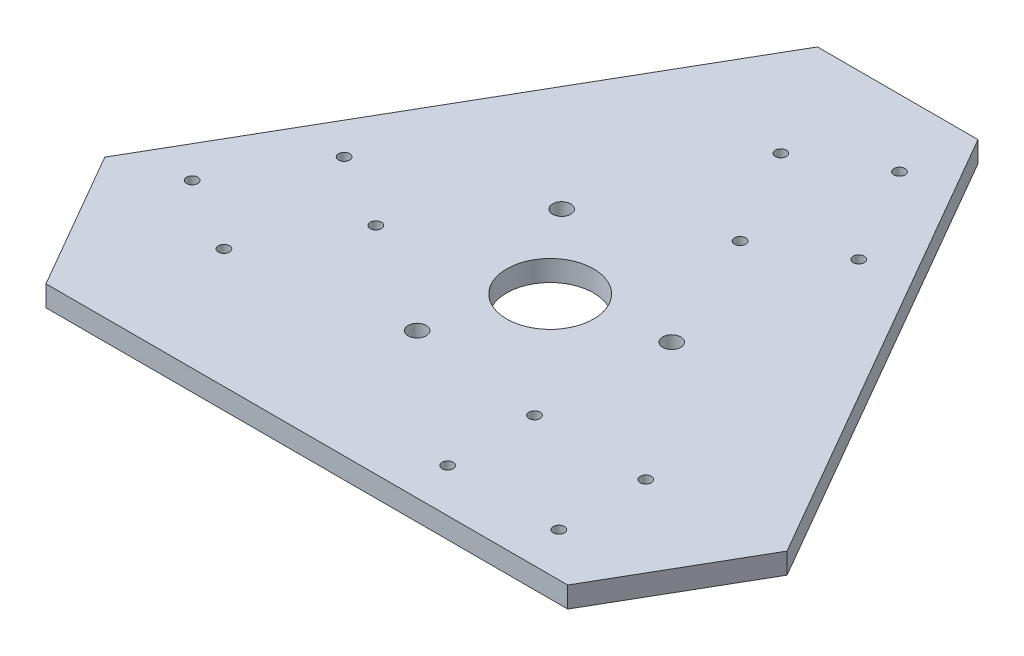
ISO-10303-21;
HEADER;
FILE_DESCRIPTION(('STEP AP214'),'2;1');
FILE_NAME('part.step','',(''),(''),'','','');
FILE_SCHEMA(('AUTOMOTIVE_DESIGN { 1 0 10303 214 1 1 1 1 }'));
ENDSEC;
DATA;
#1=APPLICATION_CONTEXT('core data for automotive mechanical design processes');
#2=APPLICATION_PROTOCOL_DEFINITION('international standard','automotive_design',2000,#1);
#3=PRODUCT_CONTEXT('',#1,'mechanical');
#4=PRODUCT('Part','Part','',(#3));
#5=PRODUCT_RELATED_PRODUCT_CATEGORY('part','',(#4));
#6=PRODUCT_DEFINITION_FORMATION('','',#4);
#7=PRODUCT_DEFINITION_CONTEXT('part definition',#1,'design');
#8=PRODUCT_DEFINITION('design','',#6,#7);
#9=PRODUCT_DEFINITION_SHAPE('','',#8);
#10=(LENGTH_UNIT() NAMED_UNIT(*) SI_UNIT(.MILLI.,.METRE.));
#11=(NAMED_UNIT(*) PLANE_ANGLE_UNIT() SI_UNIT($,.RADIAN.));
#12=(NAMED_UNIT(*) SI_UNIT($,.STERADIAN.) SOLID_ANGLE_UNIT());
#13=UNCERTAINTY_MEASURE_WITH_UNIT(LENGTH_MEASURE(1.E-05),#10,'distance_accuracy_value','');
#14=(GEOMETRIC_REPRESENTATION_CONTEXT(3) GLOBAL_UNCERTAINTY_ASSIGNED_CONTEXT((#13)) GLOBAL_UNIT_ASSIGNED_CONTEXT((#10,
#11,#12)) REPRESENTATION_CONTEXT('',''));
#15=CARTESIAN_POINT('',(0.,0.,0.));
#16=DIRECTION('',(0.,0.,1.));
#17=DIRECTION('',(1.,0.,0.));
#18=AXIS2_PLACEMENT_3D('',#15,#16,#17);
#19=CARTESIAN_POINT('',(57.7350269189626,6.,100.));
#20=DIRECTION('',(-0.866025403784439,0.,-0.5));
#21=DIRECTION('',(-0.5,0.,0.866025403784439));
#22=AXIS2_PLACEMENT_3D('',#19,#20,#21);
#23=PLANE('',#22);
#24=DIRECTION('',(0.5,0.,-0.866025403784439));
#25=VECTOR('',#24,1.);
#26=CARTESIAN_POINT('',(57.7350269189626,0.,100.));
#27=LINE('',#26,#25);
#28=CARTESIAN_POINT('',(75.0555349946514,0.,70.));
#29=VERTEX_POINT('',#28);
#30=CARTESIAN_POINT('',(98.1495457622364,0.,30.0000000000001));
#31=VERTEX_POINT('',#30);
#32=EDGE_CURVE('E102',#29,#31,#27,.T.);
#33=ORIENTED_EDGE('',*,*,#32,.T.);
#34=DIRECTION('',(0.,1.,0.));
#35=VECTOR('',#34,1.);
#36=CARTESIAN_POINT('',(98.1495457622363,0.,30.));
#37=LINE('',#36,#35);
#38=CARTESIAN_POINT('',(98.1495457622363,6.,30.));
#39=VERTEX_POINT('',#38);
#40=EDGE_CURVE('E132',#31,#39,#37,.T.);
#41=ORIENTED_EDGE('',*,*,#40,.T.);
#42=DIRECTION('',(0.5,0.,-0.866025403784439));
#43=VECTOR('',#42,1.);
#44=CARTESIAN_POINT('',(57.7350269189626,6.,100.));
#45=LINE('',#44,#43);
#46=CARTESIAN_POINT('',(75.0555349946514,6.,70.));
#47=VERTEX_POINT('',#46);
#48=EDGE_CURVE('E104',#47,#39,#45,.T.);
#49=ORIENTED_EDGE('',*,*,#48,.F.);
#50=DIRECTION('',(0.,1.,0.));
#51=VECTOR('',#50,1.);
#52=CARTESIAN_POINT('',(75.0555349946514,0.,70.));
#53=LINE('',#52,#51);
#54=EDGE_CURVE('E90',#29,#47,#53,.T.);
#55=ORIENTED_EDGE('',*,*,#54,.F.);
#56=EDGE_LOOP('',(#33,#41,#49,#55));
#57=FACE_BOUND('',#56,.T.);
#58=ADVANCED_FACE('F36',(#57),#23,.F.);
#59=CARTESIAN_POINT('',(57.7350269189626,6.,-100.));
#60=DIRECTION('',(0.,0.,1.));
#61=DIRECTION('',(1.,0.,0.));
#62=AXIS2_PLACEMENT_3D('',#59,#60,#61);
#63=PLANE('',#62);
#64=DIRECTION('',(-1.,0.,0.));
#65=VECTOR('',#64,1.);
#66=CARTESIAN_POINT('',(57.7350269189626,6.,-100.));
#67=LINE('',#66,#65);
#68=CARTESIAN_POINT('',(23.0940107675849,6.,-100.));
#69=VERTEX_POINT('',#68);
#70=CARTESIAN_POINT('',(-23.0940107675851,6.,-100.));
#71=VERTEX_POINT('',#70);
#72=EDGE_CURVE('E44',#69,#71,#67,.T.);
#73=ORIENTED_EDGE('',*,*,#72,.F.);
#74=DIRECTION('',(0.,1.,0.));
#75=VECTOR('',#74,1.);
#76=CARTESIAN_POINT('',(23.0940107675849,0.,-100.));
#77=LINE('',#76,#75);
#78=CARTESIAN_POINT('',(23.0940107675849,0.,-100.));
#79=VERTEX_POINT('',#78);
#80=EDGE_CURVE('E130',#79,#69,#77,.T.);
#81=ORIENTED_EDGE('',*,*,#80,.F.);
#82=DIRECTION('',(-1.,0.,0.));
#83=VECTOR('',#82,1.);
#84=CARTESIAN_POINT('',(57.7350269189626,0.,-100.));
#85=LINE('',#84,#83);
#86=CARTESIAN_POINT('',(-23.094010767585,0.,-100.));
#87=VERTEX_POINT('',#86);
#88=EDGE_CURVE('E110',#79,#87,#85,.T.);
#89=ORIENTED_EDGE('',*,*,#88,.T.);
#90=DIRECTION('',(0.,1.,0.));
#91=VECTOR('',#90,1.);
#92=CARTESIAN_POINT('',(-23.0940107675851,0.,-100.));
#93=LINE('',#92,#91);
#94=EDGE_CURVE('E52',#87,#71,#93,.T.);
#95=ORIENTED_EDGE('',*,*,#94,.T.);
#96=EDGE_LOOP('',(#73,#81,#89,#95));
#97=FACE_BOUND('',#96,.T.);
#98=ADVANCED_FACE('F271',(#97),#63,.F.);
#99=CARTESIAN_POINT('',(-115.470053837925,6.,0.));
#100=DIRECTION('',(0.866025403784439,0.,-0.5));
#101=DIRECTION('',(-0.5,0.,-0.866025403784439));
#102=AXIS2_PLACEMENT_3D('',#99,#100,#101);
#103=PLANE('',#102);
#104=DIRECTION('',(0.5,0.,0.866025403784439));
#105=VECTOR('',#104,1.);
#106=CARTESIAN_POINT('',(-115.470053837925,0.,0.));
#107=LINE('',#106,#105);
#108=CARTESIAN_POINT('',(-98.1495457622364,0.,30.));
#109=VERTEX_POINT('',#108);
#110=CARTESIAN_POINT('',(-75.0555349946514,0.,70.));
#111=VERTEX_POINT('',#110);
#112=EDGE_CURVE('E39',#109,#111,#107,.T.);
#113=ORIENTED_EDGE('',*,*,#112,.T.);
#114=DIRECTION('',(0.,1.,0.));
#115=VECTOR('',#114,1.);
#116=CARTESIAN_POINT('',(-75.0555349946514,0.,70.));
#117=LINE('',#116,#115);
#118=CARTESIAN_POINT('',(-75.0555349946514,6.,70.));
#119=VERTEX_POINT('',#118);
#120=EDGE_CURVE('E60',#111,#119,#117,.T.);
#121=ORIENTED_EDGE('',*,*,#120,.T.);
#122=DIRECTION('',(0.5,0.,0.866025403784439));
#123=VECTOR('',#122,1.);
#124=CARTESIAN_POINT('',(-115.470053837925,6.,0.));
#125=LINE('',#124,#123);
#126=CARTESIAN_POINT('',(-98.1495457622364,6.,30.));
#127=VERTEX_POINT('',#126);
#128=EDGE_CURVE('E11',#127,#119,#125,.T.);
#129=ORIENTED_EDGE('',*,*,#128,.F.);
#130=DIRECTION('',(0.,1.,0.));
#131=VECTOR('',#130,1.);
#132=CARTESIAN_POINT('',(-98.1495457622364,0.,30.));
#133=LINE('',#132,#131);
#134=EDGE_CURVE('E123',#109,#127,#133,.T.);
#135=ORIENTED_EDGE('',*,*,#134,.F.);
#136=EDGE_LOOP('',(#113,#121,#129,#135));
#137=FACE_BOUND('',#136,.T.);
#138=ADVANCED_FACE('F236',(#137),#103,.F.);
#139=CARTESIAN_POINT('',(0.,6.,0.));
#140=DIRECTION('',(0.,1.,0.));
#141=DIRECTION('',(0.,0.,1.));
#142=AXIS2_PLACEMENT_3D('',#139,#140,#141);
#143=PLANE('',#142);
#144=CARTESIAN_POINT('',(-58.1458256229943,6.,35.7115242270663));
#145=DIRECTION('',(0.,1.,0.));
#146=DIRECTION('',(0.,0.,1.));
#147=AXIS2_PLACEMENT_3D('',#144,#145,#146);
#148=CIRCLE('',#147,1.59999999999999);
#149=CARTESIAN_POINT('',(-58.1458256229943,6.,37.3115242270663));
#150=VERTEX_POINT('',#149);
#151=EDGE_CURVE('E204',#150,#150,#148,.T.);
#152=ORIENTED_EDGE('',*,*,#151,.F.);
#153=EDGE_LOOP('',(#152));
#154=FACE_BOUND('',#153,.T.);
#155=CARTESIAN_POINT('',(28.,6.,57.5));
#156=DIRECTION('',(0.,1.,0.));
#157=DIRECTION('',(0.,0.,1.));
#158=AXIS2_PLACEMENT_3D('',#155,#156,#157);
#159=CIRCLE('',#158,1.6);
#160=CARTESIAN_POINT('',(28.,6.,59.1));
#161=VERTEX_POINT('',#160);
#162=EDGE_CURVE('E194',#161,#161,#159,.T.);
#163=ORIENTED_EDGE('',*,*,#162,.F.);
#164=EDGE_LOOP('',(#163));
#165=FACE_BOUND('',#164,.T.);
#166=CARTESIAN_POINT('',(60.,6.,57.5));
#167=DIRECTION('',(0.,1.,0.));
#168=DIRECTION('',(0.,0.,1.));
#169=AXIS2_PLACEMENT_3D('',#166,#167,#168);
#170=CIRCLE('',#169,1.60000000000001);
#171=CARTESIAN_POINT('',(60.,6.,59.1));
#172=VERTEX_POINT('',#171);
#173=EDGE_CURVE('E193',#172,#172,#170,.T.);
#174=ORIENTED_EDGE('',*,*,#173,.F.);
#175=EDGE_LOOP('',(#174));
#176=FACE_BOUND('',#175,.T.);
#177=CARTESIAN_POINT('',(28.,6.,32.5));
#178=DIRECTION('',(0.,1.,0.));
#179=DIRECTION('',(0.,0.,1.));
#180=AXIS2_PLACEMENT_3D('',#177,#178,#179);
#181=CIRCLE('',#180,1.6);
#182=CARTESIAN_POINT('',(28.,6.,34.1));
#183=VERTEX_POINT('',#182);
#184=EDGE_CURVE('E161',#183,#183,#181,.T.);
#185=ORIENTED_EDGE('',*,*,#184,.F.);
#186=EDGE_LOOP('',(#185));
#187=FACE_BOUND('',#186,.T.);
#188=CARTESIAN_POINT('',(-42.1458256229943,6.,7.9987113059643));
#189=DIRECTION('',(0.,1.,0.));
#190=DIRECTION('',(0.,0.,1.));
#191=AXIS2_PLACEMENT_3D('',#188,#189,#190);
#192=CIRCLE('',#191,1.6);
#193=CARTESIAN_POINT('',(-42.1458256229943,6.,9.5987113059643));
#194=VERTEX_POINT('',#193);
#195=EDGE_CURVE('E186',#194,#194,#192,.T.);
#196=ORIENTED_EDGE('',*,*,#195,.F.);
#197=EDGE_LOOP('',(#196));
#198=FACE_BOUND('',#197,.T.);
#199=CARTESIAN_POINT('',(-79.7964607176052,6.,23.2115242270663));
#200=DIRECTION('',(0.,1.,0.));
#201=DIRECTION('',(0.,0.,1.));
#202=AXIS2_PLACEMENT_3D('',#199,#200,#201);
#203=CIRCLE('',#202,1.59999999999999);
#204=CARTESIAN_POINT('',(-79.7964607176052,6.,24.8115242270663));
#205=VERTEX_POINT('',#204);
#206=EDGE_CURVE('E180',#205,#205,#203,.T.);
#207=ORIENTED_EDGE('',*,*,#206,.F.);
#208=EDGE_LOOP('',(#207));
#209=FACE_BOUND('',#208,.T.);
#210=CARTESIAN_POINT('',(-63.7964607176052,6.,-4.5012886940357));
#211=DIRECTION('',(0.,1.,0.));
#212=DIRECTION('',(0.,0.,1.));
#213=AXIS2_PLACEMENT_3D('',#210,#211,#212);
#214=CIRCLE('',#213,1.60000000000001);
#215=CARTESIAN_POINT('',(-63.7964607176052,6.,-2.90128869403569));
#216=VERTEX_POINT('',#215);
#217=EDGE_CURVE('E174',#216,#216,#214,.T.);
#218=ORIENTED_EDGE('',*,*,#217,.F.);
#219=EDGE_LOOP('',(#218));
#220=FACE_BOUND('',#219,.T.);
#221=CARTESIAN_POINT('',(-1.85417437700576,6.,-68.2115242270663));
#222=DIRECTION('',(0.,1.,0.));
#223=DIRECTION('',(0.,0.,1.));
#224=AXIS2_PLACEMENT_3D('',#221,#222,#223);
#225=CIRCLE('',#224,1.6);
#226=CARTESIAN_POINT('',(-1.85417437700576,6.,-66.6115242270663));
#227=VERTEX_POINT('',#226);
#228=EDGE_CURVE('E167',#227,#227,#225,.T.);
#229=ORIENTED_EDGE('',*,*,#228,.F.);
#230=EDGE_LOOP('',(#229));
#231=FACE_BOUND('',#230,.T.);
#232=CARTESIAN_POINT('',(14.1458256229943,6.,-40.4987113059643));
#233=DIRECTION('',(0.,1.,0.));
#234=DIRECTION('',(0.,0.,1.));
#235=AXIS2_PLACEMENT_3D('',#232,#233,#234);
#236=CIRCLE('',#235,1.6);
#237=CARTESIAN_POINT('',(14.1458256229943,6.,-38.8987113059643));
#238=VERTEX_POINT('',#237);
#239=EDGE_CURVE('E168',#238,#238,#236,.T.);
#240=ORIENTED_EDGE('',*,*,#239,.F.);
#241=EDGE_LOOP('',(#240));
#242=FACE_BOUND('',#241,.T.);
#243=CARTESIAN_POINT('',(19.7964607176052,6.,-80.7115242270663));
#244=DIRECTION('',(0.,1.,0.));
#245=DIRECTION('',(0.,0.,1.));
#246=AXIS2_PLACEMENT_3D('',#243,#244,#245);
#247=CIRCLE('',#246,1.60000000000001);
#248=CARTESIAN_POINT('',(19.7964607176052,6.,-79.1115242270663));
#249=VERTEX_POINT('',#248);
#250=EDGE_CURVE('E221',#249,#249,#247,.T.);
#251=ORIENTED_EDGE('',*,*,#250,.F.);
#252=EDGE_LOOP('',(#251));
#253=FACE_BOUND('',#252,.T.);
#254=CARTESIAN_POINT('',(35.7964607176052,6.,-52.9987113059643));
#255=DIRECTION('',(0.,1.,0.));
#256=DIRECTION('',(0.,0.,1.));
#257=AXIS2_PLACEMENT_3D('',#254,#255,#256);
#258=CIRCLE('',#257,1.6);
#259=CARTESIAN_POINT('',(35.7964607176052,6.,-51.3987113059643));
#260=VERTEX_POINT('',#259);
#261=EDGE_CURVE('E215',#260,#260,#258,.T.);
#262=ORIENTED_EDGE('',*,*,#261,.F.);
#263=EDGE_LOOP('',(#262));
#264=FACE_BOUND('',#263,.T.);
#265=CARTESIAN_POINT('',(60.,6.,32.5));
#266=DIRECTION('',(0.,1.,0.));
#267=DIRECTION('',(0.,0.,1.));
#268=AXIS2_PLACEMENT_3D('',#265,#266,#267);
#269=CIRCLE('',#268,1.60000000000001);
#270=CARTESIAN_POINT('',(60.,6.,34.1));
#271=VERTEX_POINT('',#270);
#272=EDGE_CURVE('E144',#271,#271,#269,.T.);
#273=ORIENTED_EDGE('',*,*,#272,.F.);
#274=EDGE_LOOP('',(#273));
#275=FACE_BOUND('',#274,.T.);
#276=CARTESIAN_POINT('',(-10.,6.,28.2842712474619));
#277=DIRECTION('',(0.,1.,0.));
#278=DIRECTION('',(0.,0.,1.));
#279=AXIS2_PLACEMENT_3D('',#276,#277,#278);
#280=CIRCLE('',#279,2.6);
#281=CARTESIAN_POINT('',(-10.,6.,30.8842712474619));
#282=VERTEX_POINT('',#281);
#283=EDGE_CURVE('E153',#282,#282,#280,.T.);
#284=ORIENTED_EDGE('',*,*,#283,.F.);
#285=EDGE_LOOP('',(#284));
#286=FACE_BOUND('',#285,.T.);
#287=CARTESIAN_POINT('',(-19.4948974278318,6.,-22.8023896615753));
#288=DIRECTION('',(0.,1.,0.));
#289=DIRECTION('',(0.,0.,1.));
#290=AXIS2_PLACEMENT_3D('',#287,#288,#289);
#291=CIRCLE('',#290,2.6);
#292=CARTESIAN_POINT('',(-19.4948974278318,6.,-20.2023896615753));
#293=VERTEX_POINT('',#292);
#294=EDGE_CURVE('E147',#293,#293,#291,.T.);
#295=ORIENTED_EDGE('',*,*,#294,.F.);
#296=EDGE_LOOP('',(#295));
#297=FACE_BOUND('',#296,.T.);
#298=CARTESIAN_POINT('',(29.4948974278318,6.,-5.48188158588658));
#299=DIRECTION('',(0.,1.,0.));
#300=DIRECTION('',(0.,0.,1.));
#301=AXIS2_PLACEMENT_3D('',#298,#299,#300);
#302=CIRCLE('',#301,2.6);
#303=CARTESIAN_POINT('',(29.4948974278318,6.,-2.88188158588658));
#304=VERTEX_POINT('',#303);
#305=EDGE_CURVE('E140',#304,#304,#302,.T.);
#306=ORIENTED_EDGE('',*,*,#305,.F.);
#307=EDGE_LOOP('',(#306));
#308=FACE_BOUND('',#307,.T.);
#309=DIRECTION('',(0.5,0.,0.866025403784439));
#310=VECTOR('',#309,1.);
#311=CARTESIAN_POINT('',(98.1495457622363,6.,30.));
#312=LINE('',#311,#310);
#313=EDGE_CURVE('E134',#69,#39,#312,.T.);
#314=ORIENTED_EDGE('',*,*,#313,.F.);
#315=ORIENTED_EDGE('',*,*,#72,.T.);
#316=DIRECTION('',(0.5,0.,-0.866025403784439));
#317=VECTOR('',#316,1.);
#318=CARTESIAN_POINT('',(-23.0940107675851,6.,-100.));
#319=LINE('',#318,#317);
#320=EDGE_CURVE('E127',#127,#71,#319,.T.);
#321=ORIENTED_EDGE('',*,*,#320,.F.);
#322=ORIENTED_EDGE('',*,*,#128,.T.);
#323=DIRECTION('',(-1.,0.,0.));
#324=VECTOR('',#323,1.);
#325=CARTESIAN_POINT('',(-75.0555349946514,6.,70.));
#326=LINE('',#325,#324);
#327=EDGE_CURVE('E96',#47,#119,#326,.T.);
#328=ORIENTED_EDGE('',*,*,#327,.F.);
#329=ORIENTED_EDGE('',*,*,#48,.T.);
#330=EDGE_LOOP('',(#314,#315,#321,#322,#328,#329));
#331=FACE_BOUND('',#330,.T.);
#332=CARTESIAN_POINT('',(0.,6.,0.));
#333=DIRECTION('',(0.,1.,0.));
#334=DIRECTION('',(0.,0.,1.));
#335=AXIS2_PLACEMENT_3D('',#332,#333,#334);
#336=CIRCLE('',#335,12.5);
#337=CARTESIAN_POINT('',(0.,6.,12.5));
#338=VERTEX_POINT('',#337);
#339=EDGE_CURVE('E115',#338,#338,#336,.T.);
#340=ORIENTED_EDGE('',*,*,#339,.F.);
#341=EDGE_LOOP('',(#340));
#342=FACE_BOUND('',#341,.T.);
#343=ADVANCED_FACE('F233',(#154,#165,#176,#187,#198,#209,#220,#231,#242,#253,#264,#275,#286,
#297,#308,#331,#342),#143,.T.);
#344=CARTESIAN_POINT('',(0.,0.,0.));
#345=DIRECTION('',(0.,1.,0.));
#346=DIRECTION('',(0.,0.,1.));
#347=AXIS2_PLACEMENT_3D('',#344,#345,#346);
#348=PLANE('',#347);
#349=CARTESIAN_POINT('',(-58.1458256229943,0.,35.7115242270663));
#350=DIRECTION('',(0.,1.,0.));
#351=DIRECTION('',(0.,0.,1.));
#352=AXIS2_PLACEMENT_3D('',#349,#350,#351);
#353=CIRCLE('',#352,1.59999999999999);
#354=CARTESIAN_POINT('',(-58.1458256229943,0.,37.3115242270663));
#355=VERTEX_POINT('',#354);
#356=EDGE_CURVE('E189',#355,#355,#353,.T.);
#357=ORIENTED_EDGE('',*,*,#356,.T.);
#358=EDGE_LOOP('',(#357));
#359=FACE_BOUND('',#358,.T.);
#360=CARTESIAN_POINT('',(28.,0.,57.5));
#361=DIRECTION('',(0.,1.,0.));
#362=DIRECTION('',(0.,0.,1.));
#363=AXIS2_PLACEMENT_3D('',#360,#361,#362);
#364=CIRCLE('',#363,1.6);
#365=CARTESIAN_POINT('',(28.,0.,59.1));
#366=VERTEX_POINT('',#365);
#367=EDGE_CURVE('E207',#366,#366,#364,.T.);
#368=ORIENTED_EDGE('',*,*,#367,.T.);
#369=EDGE_LOOP('',(#368));
#370=FACE_BOUND('',#369,.T.);
#371=CARTESIAN_POINT('',(60.,0.,57.5));
#372=DIRECTION('',(0.,1.,0.));
#373=DIRECTION('',(0.,0.,1.));
#374=AXIS2_PLACEMENT_3D('',#371,#372,#373);
#375=CIRCLE('',#374,1.60000000000001);
#376=CARTESIAN_POINT('',(60.,0.,59.1));
#377=VERTEX_POINT('',#376);
#378=EDGE_CURVE('E190',#377,#377,#375,.T.);
#379=ORIENTED_EDGE('',*,*,#378,.T.);
#380=EDGE_LOOP('',(#379));
#381=FACE_BOUND('',#380,.T.);
#382=CARTESIAN_POINT('',(28.,0.,32.5));
#383=DIRECTION('',(0.,1.,0.));
#384=DIRECTION('',(0.,0.,1.));
#385=AXIS2_PLACEMENT_3D('',#382,#383,#384);
#386=CIRCLE('',#385,1.6);
#387=CARTESIAN_POINT('',(28.,0.,34.1));
#388=VERTEX_POINT('',#387);
#389=EDGE_CURVE('E197',#388,#388,#386,.T.);
#390=ORIENTED_EDGE('',*,*,#389,.T.);
#391=EDGE_LOOP('',(#390));
#392=FACE_BOUND('',#391,.T.);
#393=CARTESIAN_POINT('',(-42.1458256229943,0.,7.9987113059643));
#394=DIRECTION('',(0.,1.,0.));
#395=DIRECTION('',(0.,0.,1.));
#396=AXIS2_PLACEMENT_3D('',#393,#394,#395);
#397=CIRCLE('',#396,1.6);
#398=CARTESIAN_POINT('',(-42.1458256229943,0.,9.5987113059643));
#399=VERTEX_POINT('',#398);
#400=EDGE_CURVE('E183',#399,#399,#397,.T.);
#401=ORIENTED_EDGE('',*,*,#400,.T.);
#402=EDGE_LOOP('',(#401));
#403=FACE_BOUND('',#402,.T.);
#404=CARTESIAN_POINT('',(-79.7964607176052,0.,23.2115242270663));
#405=DIRECTION('',(0.,1.,0.));
#406=DIRECTION('',(0.,0.,1.));
#407=AXIS2_PLACEMENT_3D('',#404,#405,#406);
#408=CIRCLE('',#407,1.59999999999999);
#409=CARTESIAN_POINT('',(-79.7964607176052,0.,24.8115242270663));
#410=VERTEX_POINT('',#409);
#411=EDGE_CURVE('E177',#410,#410,#408,.T.);
#412=ORIENTED_EDGE('',*,*,#411,.T.);
#413=EDGE_LOOP('',(#412));
#414=FACE_BOUND('',#413,.T.);
#415=CARTESIAN_POINT('',(-63.7964607176052,0.,-4.5012886940357));
#416=DIRECTION('',(0.,1.,0.));
#417=DIRECTION('',(0.,0.,1.));
#418=AXIS2_PLACEMENT_3D('',#415,#416,#417);
#419=CIRCLE('',#418,1.60000000000001);
#420=CARTESIAN_POINT('',(-63.7964607176052,0.,-2.90128869403569));
#421=VERTEX_POINT('',#420);
#422=EDGE_CURVE('E171',#421,#421,#419,.T.);
#423=ORIENTED_EDGE('',*,*,#422,.T.);
#424=EDGE_LOOP('',(#423));
#425=FACE_BOUND('',#424,.T.);
#426=CARTESIAN_POINT('',(-1.85417437700576,0.,-68.2115242270663));
#427=DIRECTION('',(0.,1.,0.));
#428=DIRECTION('',(0.,0.,1.));
#429=AXIS2_PLACEMENT_3D('',#426,#427,#428);
#430=CIRCLE('',#429,1.6);
#431=CARTESIAN_POINT('',(-1.85417437700576,0.,-66.6115242270663));
#432=VERTEX_POINT('',#431);
#433=EDGE_CURVE('E164',#432,#432,#430,.T.);
#434=ORIENTED_EDGE('',*,*,#433,.T.);
#435=EDGE_LOOP('',(#434));
#436=FACE_BOUND('',#435,.T.);
#437=CARTESIAN_POINT('',(14.1458256229943,0.,-40.4987113059643));
#438=DIRECTION('',(0.,1.,0.));
#439=DIRECTION('',(0.,0.,1.));
#440=AXIS2_PLACEMENT_3D('',#437,#438,#439);
#441=CIRCLE('',#440,1.6);
#442=CARTESIAN_POINT('',(14.1458256229943,0.,-38.8987113059643));
#443=VERTEX_POINT('',#442);
#444=EDGE_CURVE('E224',#443,#443,#441,.T.);
#445=ORIENTED_EDGE('',*,*,#444,.T.);
#446=EDGE_LOOP('',(#445));
#447=FACE_BOUND('',#446,.T.);
#448=CARTESIAN_POINT('',(19.7964607176052,0.,-80.7115242270663));
#449=DIRECTION('',(0.,1.,0.));
#450=DIRECTION('',(0.,0.,1.));
#451=AXIS2_PLACEMENT_3D('',#448,#449,#450);
#452=CIRCLE('',#451,1.60000000000001);
#453=CARTESIAN_POINT('',(19.7964607176052,0.,-79.1115242270663));
#454=VERTEX_POINT('',#453);
#455=EDGE_CURVE('E218',#454,#454,#452,.T.);
#456=ORIENTED_EDGE('',*,*,#455,.T.);
#457=EDGE_LOOP('',(#456));
#458=FACE_BOUND('',#457,.T.);
#459=CARTESIAN_POINT('',(35.7964607176052,0.,-52.9987113059643));
#460=DIRECTION('',(0.,1.,0.));
#461=DIRECTION('',(0.,0.,1.));
#462=AXIS2_PLACEMENT_3D('',#459,#460,#461);
#463=CIRCLE('',#462,1.6);
#464=CARTESIAN_POINT('',(35.7964607176052,0.,-51.3987113059643));
#465=VERTEX_POINT('',#464);
#466=EDGE_CURVE('E212',#465,#465,#463,.T.);
#467=ORIENTED_EDGE('',*,*,#466,.T.);
#468=EDGE_LOOP('',(#467));
#469=FACE_BOUND('',#468,.T.);
#470=CARTESIAN_POINT('',(60.,0.,32.5));
#471=DIRECTION('',(0.,1.,0.));
#472=DIRECTION('',(0.,0.,1.));
#473=AXIS2_PLACEMENT_3D('',#470,#471,#472);
#474=CIRCLE('',#473,1.60000000000001);
#475=CARTESIAN_POINT('',(60.,0.,34.1));
#476=VERTEX_POINT('',#475);
#477=EDGE_CURVE('E158',#476,#476,#474,.T.);
#478=ORIENTED_EDGE('',*,*,#477,.T.);
#479=EDGE_LOOP('',(#478));
#480=FACE_BOUND('',#479,.T.);
#481=CARTESIAN_POINT('',(-10.,0.,28.2842712474619));
#482=DIRECTION('',(0.,1.,0.));
#483=DIRECTION('',(0.,0.,1.));
#484=AXIS2_PLACEMENT_3D('',#481,#482,#483);
#485=CIRCLE('',#484,2.6);
#486=CARTESIAN_POINT('',(-10.,0.,30.8842712474619));
#487=VERTEX_POINT('',#486);
#488=EDGE_CURVE('E136',#487,#487,#485,.T.);
#489=ORIENTED_EDGE('',*,*,#488,.T.);
#490=EDGE_LOOP('',(#489));
#491=FACE_BOUND('',#490,.T.);
#492=CARTESIAN_POINT('',(-19.4948974278318,0.,-22.8023896615753));
#493=DIRECTION('',(0.,1.,0.));
#494=DIRECTION('',(0.,0.,1.));
#495=AXIS2_PLACEMENT_3D('',#492,#493,#494);
#496=CIRCLE('',#495,2.6);
#497=CARTESIAN_POINT('',(-19.4948974278318,0.,-20.2023896615753));
#498=VERTEX_POINT('',#497);
#499=EDGE_CURVE('E150',#498,#498,#496,.T.);
#500=ORIENTED_EDGE('',*,*,#499,.T.);
#501=EDGE_LOOP('',(#500));
#502=FACE_BOUND('',#501,.T.);
#503=CARTESIAN_POINT('',(29.4948974278318,0.,-5.48188158588658));
#504=DIRECTION('',(0.,1.,0.));
#505=DIRECTION('',(0.,0.,1.));
#506=AXIS2_PLACEMENT_3D('',#503,#504,#505);
#507=CIRCLE('',#506,2.6);
#508=CARTESIAN_POINT('',(29.4948974278318,0.,-2.88188158588658));
#509=VERTEX_POINT('',#508);
#510=EDGE_CURVE('E143',#509,#509,#507,.T.);
#511=ORIENTED_EDGE('',*,*,#510,.T.);
#512=EDGE_LOOP('',(#511));
#513=FACE_BOUND('',#512,.T.);
#514=CARTESIAN_POINT('',(0.,0.,0.));
#515=DIRECTION('',(0.,1.,0.));
#516=DIRECTION('',(0.,0.,1.));
#517=AXIS2_PLACEMENT_3D('',#514,#515,#516);
#518=CIRCLE('',#517,12.5);
#519=CARTESIAN_POINT('',(0.,0.,12.5));
#520=VERTEX_POINT('',#519);
#521=EDGE_CURVE('E111',#520,#520,#518,.T.);
#522=ORIENTED_EDGE('',*,*,#521,.T.);
#523=EDGE_LOOP('',(#522));
#524=FACE_BOUND('',#523,.T.);
#525=ORIENTED_EDGE('',*,*,#88,.F.);
#526=DIRECTION('',(0.5,0.,0.866025403784439));
#527=VECTOR('',#526,1.);
#528=CARTESIAN_POINT('',(98.1495457622363,0.,30.));
#529=LINE('',#528,#527);
#530=EDGE_CURVE('E109',#79,#31,#529,.T.);
#531=ORIENTED_EDGE('',*,*,#530,.T.);
#532=ORIENTED_EDGE('',*,*,#32,.F.);
#533=DIRECTION('',(-1.,0.,0.));
#534=VECTOR('',#533,1.);
#535=CARTESIAN_POINT('',(-75.0555349946514,0.,70.));
#536=LINE('',#535,#534);
#537=EDGE_CURVE('E87',#29,#111,#536,.T.);
#538=ORIENTED_EDGE('',*,*,#537,.T.);
#539=ORIENTED_EDGE('',*,*,#112,.F.);
#540=DIRECTION('',(0.5,0.,-0.866025403784439));
#541=VECTOR('',#540,1.);
#542=CARTESIAN_POINT('',(-23.0940107675851,0.,-100.));
#543=LINE('',#542,#541);
#544=EDGE_CURVE('E125',#109,#87,#543,.T.);
#545=ORIENTED_EDGE('',*,*,#544,.T.);
#546=EDGE_LOOP('',(#525,#531,#532,#538,#539,#545));
#547=FACE_BOUND('',#546,.T.);
#548=ADVANCED_FACE('F108',(#359,#370,#381,#392,#403,#414,#425,#436,#447,#458,#469,#480,#491,
#502,#513,#524,#547),#348,.F.);
#549=CARTESIAN_POINT('',(0.,0.,0.));
#550=DIRECTION('',(0.,1.,0.));
#551=DIRECTION('',(0.,0.,1.));
#552=AXIS2_PLACEMENT_3D('',#549,#550,#551);
#553=CYLINDRICAL_SURFACE('',#552,12.5);
#554=ORIENTED_EDGE('',*,*,#521,.F.);
#555=EDGE_LOOP('',(#554));
#556=FACE_BOUND('',#555,.T.);
#557=ORIENTED_EDGE('',*,*,#339,.T.);
#558=EDGE_LOOP('',(#557));
#559=FACE_BOUND('',#558,.T.);
#560=ADVANCED_FACE('F256',(#556,#559),#553,.F.);
#561=CARTESIAN_POINT('',(-23.0940107675851,0.,-100.));
#562=DIRECTION('',(0.866025403784439,0.,0.5));
#563=DIRECTION('',(0.5,0.,-0.866025403784439));
#564=AXIS2_PLACEMENT_3D('',#561,#562,#563);
#565=PLANE('',#564);
#566=ORIENTED_EDGE('',*,*,#320,.T.);
#567=ORIENTED_EDGE('',*,*,#94,.F.);
#568=ORIENTED_EDGE('',*,*,#544,.F.);
#569=ORIENTED_EDGE('',*,*,#134,.T.);
#570=EDGE_LOOP('',(#566,#567,#568,#569));
#571=FACE_BOUND('',#570,.T.);
#572=ADVANCED_FACE('F258',(#571),#565,.F.);
#573=CARTESIAN_POINT('',(-75.0555349946514,0.,70.));
#574=DIRECTION('',(0.,0.,-1.));
#575=DIRECTION('',(-1.,0.,0.));
#576=AXIS2_PLACEMENT_3D('',#573,#574,#575);
#577=PLANE('',#576);
#578=ORIENTED_EDGE('',*,*,#327,.T.);
#579=ORIENTED_EDGE('',*,*,#120,.F.);
#580=ORIENTED_EDGE('',*,*,#537,.F.);
#581=ORIENTED_EDGE('',*,*,#54,.T.);
#582=EDGE_LOOP('',(#578,#579,#580,#581));
#583=FACE_BOUND('',#582,.T.);
#584=ADVANCED_FACE('F89',(#583),#577,.F.);
#585=CARTESIAN_POINT('',(98.1495457622363,0.,30.));
#586=DIRECTION('',(-0.866025403784438,0.,0.5));
#587=DIRECTION('',(0.5,0.,0.866025403784439));
#588=AXIS2_PLACEMENT_3D('',#585,#586,#587);
#589=PLANE('',#588);
#590=ORIENTED_EDGE('',*,*,#313,.T.);
#591=ORIENTED_EDGE('',*,*,#40,.F.);
#592=ORIENTED_EDGE('',*,*,#530,.F.);
#593=ORIENTED_EDGE('',*,*,#80,.T.);
#594=EDGE_LOOP('',(#590,#591,#592,#593));
#595=FACE_BOUND('',#594,.T.);
#596=ADVANCED_FACE('F286',(#595),#589,.F.);
#597=CARTESIAN_POINT('',(29.4948974278318,0.,-5.48188158588658));
#598=DIRECTION('',(0.,1.,0.));
#599=DIRECTION('',(0.,0.,1.));
#600=AXIS2_PLACEMENT_3D('',#597,#598,#599);
#601=CYLINDRICAL_SURFACE('',#600,2.6);
#602=ORIENTED_EDGE('',*,*,#510,.F.);
#603=EDGE_LOOP('',(#602));
#604=FACE_BOUND('',#603,.T.);
#605=ORIENTED_EDGE('',*,*,#305,.T.);
#606=EDGE_LOOP('',(#605));
#607=FACE_BOUND('',#606,.T.);
#608=ADVANCED_FACE('F288',(#604,#607),#601,.F.);
#609=CARTESIAN_POINT('',(-19.4948974278318,0.,-22.8023896615753));
#610=DIRECTION('',(0.,1.,0.));
#611=DIRECTION('',(0.,0.,1.));
#612=AXIS2_PLACEMENT_3D('',#609,#610,#611);
#613=CYLINDRICAL_SURFACE('',#612,2.6);
#614=ORIENTED_EDGE('',*,*,#499,.F.);
#615=EDGE_LOOP('',(#614));
#616=FACE_BOUND('',#615,.T.);
#617=ORIENTED_EDGE('',*,*,#294,.T.);
#618=EDGE_LOOP('',(#617));
#619=FACE_BOUND('',#618,.T.);
#620=ADVANCED_FACE('F294',(#616,#619),#613,.F.);
#621=CARTESIAN_POINT('',(-10.,0.,28.2842712474619));
#622=DIRECTION('',(0.,1.,0.));
#623=DIRECTION('',(0.,0.,1.));
#624=AXIS2_PLACEMENT_3D('',#621,#622,#623);
#625=CYLINDRICAL_SURFACE('',#624,2.6);
#626=ORIENTED_EDGE('',*,*,#488,.F.);
#627=EDGE_LOOP('',(#626));
#628=FACE_BOUND('',#627,.T.);
#629=ORIENTED_EDGE('',*,*,#283,.T.);
#630=EDGE_LOOP('',(#629));
#631=FACE_BOUND('',#630,.T.);
#632=ADVANCED_FACE('F301',(#628,#631),#625,.F.);
#633=CARTESIAN_POINT('',(60.,6.,32.5));
#634=DIRECTION('',(0.,-1.,0.));
#635=DIRECTION('',(0.,0.,-1.));
#636=AXIS2_PLACEMENT_3D('',#633,#634,#635);
#637=CYLINDRICAL_SURFACE('',#636,1.60000000000001);
#638=ORIENTED_EDGE('',*,*,#272,.T.);
#639=EDGE_LOOP('',(#638));
#640=FACE_BOUND('',#639,.T.);
#641=ORIENTED_EDGE('',*,*,#477,.F.);
#642=EDGE_LOOP('',(#641));
#643=FACE_BOUND('',#642,.T.);
#644=ADVANCED_FACE('F305',(#640,#643),#637,.F.);
#645=CARTESIAN_POINT('',(35.7964607176052,6.,-52.9987113059643));
#646=DIRECTION('',(0.,-1.,0.));
#647=DIRECTION('',(0.,0.,-1.));
#648=AXIS2_PLACEMENT_3D('',#645,#646,#647);
#649=CYLINDRICAL_SURFACE('',#648,1.6);
#650=ORIENTED_EDGE('',*,*,#261,.T.);
#651=EDGE_LOOP('',(#650));
#652=FACE_BOUND('',#651,.T.);
#653=ORIENTED_EDGE('',*,*,#466,.F.);
#654=EDGE_LOOP('',(#653));
#655=FACE_BOUND('',#654,.T.);
#656=ADVANCED_FACE('F309',(#652,#655),#649,.F.);
#657=CARTESIAN_POINT('',(19.7964607176052,6.,-80.7115242270663));
#658=DIRECTION('',(0.,-1.,0.));
#659=DIRECTION('',(0.,0.,-1.));
#660=AXIS2_PLACEMENT_3D('',#657,#658,#659);
#661=CYLINDRICAL_SURFACE('',#660,1.60000000000001);
#662=ORIENTED_EDGE('',*,*,#250,.T.);
#663=EDGE_LOOP('',(#662));
#664=FACE_BOUND('',#663,.T.);
#665=ORIENTED_EDGE('',*,*,#455,.F.);
#666=EDGE_LOOP('',(#665));
#667=FACE_BOUND('',#666,.T.);
#668=ADVANCED_FACE('F345',(#664,#667),#661,.F.);
#669=CARTESIAN_POINT('',(14.1458256229943,6.,-40.4987113059643));
#670=DIRECTION('',(0.,-1.,0.));
#671=DIRECTION('',(0.,0.,-1.));
#672=AXIS2_PLACEMENT_3D('',#669,#670,#671);
#673=CYLINDRICAL_SURFACE('',#672,1.6);
#674=ORIENTED_EDGE('',*,*,#239,.T.);
#675=EDGE_LOOP('',(#674));
#676=FACE_BOUND('',#675,.T.);
#677=ORIENTED_EDGE('',*,*,#444,.F.);
#678=EDGE_LOOP('',(#677));
#679=FACE_BOUND('',#678,.T.);
#680=ADVANCED_FACE('F230',(#676,#679),#673,.F.);
#681=CARTESIAN_POINT('',(-1.85417437700576,6.,-68.2115242270663));
#682=DIRECTION('',(0.,-1.,0.));
#683=DIRECTION('',(0.,0.,-1.));
#684=AXIS2_PLACEMENT_3D('',#681,#682,#683);
#685=CYLINDRICAL_SURFACE('',#684,1.6);
#686=ORIENTED_EDGE('',*,*,#228,.T.);
#687=EDGE_LOOP('',(#686));
#688=FACE_BOUND('',#687,.T.);
#689=ORIENTED_EDGE('',*,*,#433,.F.);
#690=EDGE_LOOP('',(#689));
#691=FACE_BOUND('',#690,.T.);
#692=ADVANCED_FACE('F311',(#688,#691),#685,.F.);
#693=CARTESIAN_POINT('',(-63.7964607176052,6.,-4.5012886940357));
#694=DIRECTION('',(0.,-1.,0.));
#695=DIRECTION('',(0.,0.,-1.));
#696=AXIS2_PLACEMENT_3D('',#693,#694,#695);
#697=CYLINDRICAL_SURFACE('',#696,1.60000000000001);
#698=ORIENTED_EDGE('',*,*,#217,.T.);
#699=EDGE_LOOP('',(#698));
#700=FACE_BOUND('',#699,.T.);
#701=ORIENTED_EDGE('',*,*,#422,.F.);
#702=EDGE_LOOP('',(#701));
#703=FACE_BOUND('',#702,.T.);
#704=ADVANCED_FACE('F314',(#700,#703),#697,.F.);
#705=CARTESIAN_POINT('',(-79.7964607176052,6.,23.2115242270663));
#706=DIRECTION('',(0.,-1.,0.));
#707=DIRECTION('',(0.,0.,-1.));
#708=AXIS2_PLACEMENT_3D('',#705,#706,#707);
#709=CYLINDRICAL_SURFACE('',#708,1.59999999999999);
#710=ORIENTED_EDGE('',*,*,#206,.T.);
#711=EDGE_LOOP('',(#710));
#712=FACE_BOUND('',#711,.T.);
#713=ORIENTED_EDGE('',*,*,#411,.F.);
#714=EDGE_LOOP('',(#713));
#715=FACE_BOUND('',#714,.T.);
#716=ADVANCED_FACE('F318',(#712,#715),#709,.F.);
#717=CARTESIAN_POINT('',(-42.1458256229943,6.,7.9987113059643));
#718=DIRECTION('',(0.,-1.,0.));
#719=DIRECTION('',(0.,0.,-1.));
#720=AXIS2_PLACEMENT_3D('',#717,#718,#719);
#721=CYLINDRICAL_SURFACE('',#720,1.6);
#722=ORIENTED_EDGE('',*,*,#195,.T.);
#723=EDGE_LOOP('',(#722));
#724=FACE_BOUND('',#723,.T.);
#725=ORIENTED_EDGE('',*,*,#400,.F.);
#726=EDGE_LOOP('',(#725));
#727=FACE_BOUND('',#726,.T.);
#728=ADVANCED_FACE('F322',(#724,#727),#721,.F.);
#729=CARTESIAN_POINT('',(28.,6.,32.5));
#730=DIRECTION('',(0.,-1.,0.));
#731=DIRECTION('',(0.,0.,-1.));
#732=AXIS2_PLACEMENT_3D('',#729,#730,#731);
#733=CYLINDRICAL_SURFACE('',#732,1.6);
#734=ORIENTED_EDGE('',*,*,#184,.T.);
#735=EDGE_LOOP('',(#734));
#736=FACE_BOUND('',#735,.T.);
#737=ORIENTED_EDGE('',*,*,#389,.F.);
#738=EDGE_LOOP('',(#737));
#739=FACE_BOUND('',#738,.T.);
#740=ADVANCED_FACE('F326',(#736,#739),#733,.F.);
#741=CARTESIAN_POINT('',(60.,6.,57.5));
#742=DIRECTION('',(0.,-1.,0.));
#743=DIRECTION('',(0.,0.,-1.));
#744=AXIS2_PLACEMENT_3D('',#741,#742,#743);
#745=CYLINDRICAL_SURFACE('',#744,1.60000000000001);
#746=ORIENTED_EDGE('',*,*,#173,.T.);
#747=EDGE_LOOP('',(#746));
#748=FACE_BOUND('',#747,.T.);
#749=ORIENTED_EDGE('',*,*,#378,.F.);
#750=EDGE_LOOP('',(#749));
#751=FACE_BOUND('',#750,.T.);
#752=ADVANCED_FACE('F328',(#748,#751),#745,.F.);
#753=CARTESIAN_POINT('',(28.,6.,57.5));
#754=DIRECTION('',(0.,-1.,0.));
#755=DIRECTION('',(0.,0.,-1.));
#756=AXIS2_PLACEMENT_3D('',#753,#754,#755);
#757=CYLINDRICAL_SURFACE('',#756,1.6);
#758=ORIENTED_EDGE('',*,*,#162,.T.);
#759=EDGE_LOOP('',(#758));
#760=FACE_BOUND('',#759,.T.);
#761=ORIENTED_EDGE('',*,*,#367,.F.);
#762=EDGE_LOOP('',(#761));
#763=FACE_BOUND('',#762,.T.);
#764=ADVANCED_FACE('F331',(#760,#763),#757,.F.);
#765=CARTESIAN_POINT('',(-58.1458256229943,6.,35.7115242270663));
#766=DIRECTION('',(0.,-1.,0.));
#767=DIRECTION('',(0.,0.,-1.));
#768=AXIS2_PLACEMENT_3D('',#765,#766,#767);
#769=CYLINDRICAL_SURFACE('',#768,1.59999999999999);
#770=ORIENTED_EDGE('',*,*,#151,.T.);
#771=EDGE_LOOP('',(#770));
#772=FACE_BOUND('',#771,.T.);
#773=ORIENTED_EDGE('',*,*,#356,.F.);
#774=EDGE_LOOP('',(#773));
#775=FACE_BOUND('',#774,.T.);
#776=ADVANCED_FACE('F336',(#772,#775),#769,.F.);
#777=CLOSED_SHELL('',(#58,#98,#138,#343,#548,#560,#572,#584,#596,#608,#620,#632,#644,#656,#668,
#680,#692,#704,#716,#728,#740,#752,#764,#776));
#778=MANIFOLD_SOLID_BREP('B2',#777);
#779=ADVANCED_BREP_SHAPE_REPRESENTATION('',(#18,#778),#14);
#780=SHAPE_DEFINITION_REPRESENTATION(#9,#779);
ENDSEC;
END-ISO-10303-21;
